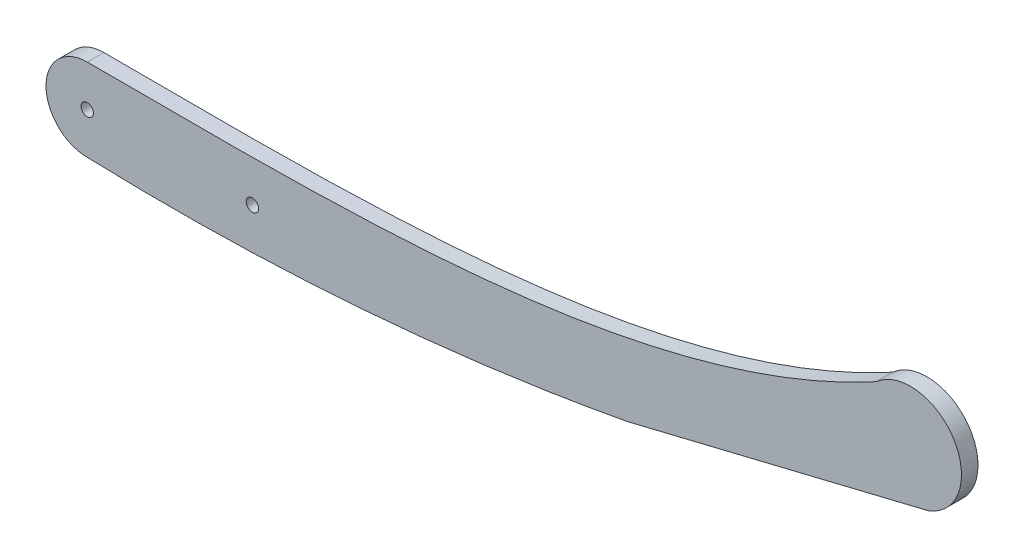
ISO-10303-21;
HEADER;
FILE_DESCRIPTION(('STEP AP214'),'2;1');
FILE_NAME('part.step','',(''),(''),'','','');
FILE_SCHEMA(('AUTOMOTIVE_DESIGN { 1 0 10303 214 1 1 1 1 }'));
ENDSEC;
DATA;
#1=APPLICATION_CONTEXT('core data for automotive mechanical design processes');
#2=APPLICATION_PROTOCOL_DEFINITION('international standard','automotive_design',2000,#1);
#3=PRODUCT_CONTEXT('',#1,'mechanical');
#4=PRODUCT('Part','Part','',(#3));
#5=PRODUCT_RELATED_PRODUCT_CATEGORY('part','',(#4));
#6=PRODUCT_DEFINITION_FORMATION('','',#4);
#7=PRODUCT_DEFINITION_CONTEXT('part definition',#1,'design');
#8=PRODUCT_DEFINITION('design','',#6,#7);
#9=PRODUCT_DEFINITION_SHAPE('','',#8);
#10=(LENGTH_UNIT() NAMED_UNIT(*) SI_UNIT(.MILLI.,.METRE.));
#11=(NAMED_UNIT(*) PLANE_ANGLE_UNIT() SI_UNIT($,.RADIAN.));
#12=(NAMED_UNIT(*) SI_UNIT($,.STERADIAN.) SOLID_ANGLE_UNIT());
#13=UNCERTAINTY_MEASURE_WITH_UNIT(LENGTH_MEASURE(1.E-05),#10,'distance_accuracy_value','');
#14=(GEOMETRIC_REPRESENTATION_CONTEXT(3) GLOBAL_UNCERTAINTY_ASSIGNED_CONTEXT((#13)) GLOBAL_UNIT_ASSIGNED_CONTEXT((#10,
#11,#12)) REPRESENTATION_CONTEXT('',''));
#15=CARTESIAN_POINT('',(0.,0.,0.));
#16=DIRECTION('',(0.,0.,1.));
#17=DIRECTION('',(1.,0.,0.));
#18=AXIS2_PLACEMENT_3D('',#15,#16,#17);
#19=CARTESIAN_POINT('',(-40.,-9.99999999997781,4.));
#20=CARTESIAN_POINT('',(4.02594483073209,-11.4538358401675,4.));
#21=CARTESIAN_POINT('',(47.6497028699741,-8.12050250477484,4.));
#22=CARTESIAN_POINT('',(90.8712741189043,1.71672525675507E-11,4.));
#23=B_SPLINE_CURVE_WITH_KNOTS('',3,(#19,#20,#21,#22),.UNSPECIFIED.,.F.,.F.,(4,4),(0.,
0.653509957849022),.UNSPECIFIED.);
#24=DIRECTION('',(0.,0.,-1.));
#25=VECTOR('',#24,1.);
#26=SURFACE_OF_LINEAR_EXTRUSION('',#23,#25);
#27=CARTESIAN_POINT('',(-40.,-9.99999999997781,0.));
#28=CARTESIAN_POINT('',(4.02594483073209,-11.4538358401675,0.));
#29=CARTESIAN_POINT('',(47.6497028699741,-8.12050250477484,0.));
#30=CARTESIAN_POINT('',(90.8712741189043,1.71672525675507E-11,0.));
#31=B_SPLINE_CURVE_WITH_KNOTS('',3,(#27,#28,#29,#30),.UNSPECIFIED.,.F.,.F.,(4,4),(0.,
0.653509957849022),.UNSPECIFIED.);
#32=CARTESIAN_POINT('',(-40.,-9.99999999997781,0.));
#33=VERTEX_POINT('',#32);
#34=CARTESIAN_POINT('',(90.8712741189043,1.71672525675507E-11,0.));
#35=VERTEX_POINT('',#34);
#36=EDGE_CURVE('E158',#33,#35,#31,.T.);
#37=ORIENTED_EDGE('',*,*,#36,.T.);
#38=DIRECTION('',(0.,0.,-1.));
#39=VECTOR('',#38,1.);
#40=CARTESIAN_POINT('',(90.8712741189043,1.71672525675507E-11,4.));
#41=LINE('',#40,#39);
#42=CARTESIAN_POINT('',(90.8712741189043,1.71672525675507E-11,4.));
#43=VERTEX_POINT('',#42);
#44=EDGE_CURVE('E11',#43,#35,#41,.T.);
#45=ORIENTED_EDGE('',*,*,#44,.F.);
#46=CARTESIAN_POINT('',(-40.,-9.99999999997781,4.));
#47=VERTEX_POINT('',#46);
#48=EDGE_CURVE('E131',#47,#43,#23,.T.);
#49=ORIENTED_EDGE('',*,*,#48,.F.);
#50=DIRECTION('',(0.,0.,-1.));
#51=VECTOR('',#50,1.);
#52=CARTESIAN_POINT('',(-40.,-9.99999999997781,4.));
#53=LINE('',#52,#51);
#54=EDGE_CURVE('E106',#47,#33,#53,.T.);
#55=ORIENTED_EDGE('',*,*,#54,.T.);
#56=EDGE_LOOP('',(#37,#45,#49,#55));
#57=FACE_BOUND('',#56,.T.);
#58=ADVANCED_FACE('F36',(#57),#26,.F.);
#59=CARTESIAN_POINT('',(5.08285377273645,-20.8818101708942,4.));
#60=DIRECTION('',(-0.23650509394564,0.971630248879564,0.));
#61=DIRECTION('',(-0.971630248879565,-0.23650509394564,0.));
#62=AXIS2_PLACEMENT_3D('',#59,#60,#61);
#63=PLANE('',#62);
#64=DIRECTION('',(0.971630248879565,0.23650509394564,0.));
#65=VECTOR('',#64,1.);
#66=CARTESIAN_POINT('',(5.08285377273645,-20.8818101708942,0.));
#67=LINE('',#66,#65);
#68=CARTESIAN_POINT('',(163.684000860577,17.7233889109076,0.));
#69=VERTEX_POINT('',#68);
#70=EDGE_CURVE('E157',#35,#69,#67,.T.);
#71=ORIENTED_EDGE('',*,*,#70,.T.);
#72=DIRECTION('',(0.,0.,-1.));
#73=VECTOR('',#72,1.);
#74=CARTESIAN_POINT('',(163.684000860577,17.7233889109076,4.));
#75=LINE('',#74,#73);
#76=CARTESIAN_POINT('',(163.684000860577,17.7233889109076,4.));
#77=VERTEX_POINT('',#76);
#78=EDGE_CURVE('E45',#77,#69,#75,.T.);
#79=ORIENTED_EDGE('',*,*,#78,.F.);
#80=DIRECTION('',(0.971630248879565,0.23650509394564,0.));
#81=VECTOR('',#80,1.);
#82=CARTESIAN_POINT('',(5.08285377273645,-20.8818101708942,4.));
#83=LINE('',#82,#81);
#84=EDGE_CURVE('E83',#43,#77,#83,.T.);
#85=ORIENTED_EDGE('',*,*,#84,.F.);
#86=ORIENTED_EDGE('',*,*,#44,.T.);
#87=EDGE_LOOP('',(#71,#79,#85,#86));
#88=FACE_BOUND('',#87,.T.);
#89=ADVANCED_FACE('F125',(#88),#63,.F.);
#90=CARTESIAN_POINT('',(159.388191828581,29.3174132501751,4.));
#91=DIRECTION('',(0.,0.,-1.));
#92=DIRECTION('',(-1.,0.,0.));
#93=AXIS2_PLACEMENT_3D('',#90,#91,#92);
#94=CYLINDRICAL_SURFACE('',#93,12.3642782085698);
#95=CARTESIAN_POINT('',(159.388191828581,29.3174132501751,0.));
#96=DIRECTION('',(0.,0.,1.));
#97=DIRECTION('',(1.,0.,0.));
#98=AXIS2_PLACEMENT_3D('',#95,#96,#97);
#99=CIRCLE('',#98,12.3642782085698);
#100=CARTESIAN_POINT('',(151.130268959291,38.5197002215628,0.));
#101=VERTEX_POINT('',#100);
#102=EDGE_CURVE('E99',#69,#101,#99,.T.);
#103=ORIENTED_EDGE('',*,*,#102,.T.);
#104=DIRECTION('',(0.,0.,-1.));
#105=VECTOR('',#104,1.);
#106=CARTESIAN_POINT('',(151.130268959291,38.5197002215628,4.));
#107=LINE('',#106,#105);
#108=CARTESIAN_POINT('',(151.130268959291,38.5197002215628,4.));
#109=VERTEX_POINT('',#108);
#110=EDGE_CURVE('E96',#109,#101,#107,.T.);
#111=ORIENTED_EDGE('',*,*,#110,.F.);
#112=CARTESIAN_POINT('',(159.388191828581,29.3174132501751,4.));
#113=DIRECTION('',(0.,0.,1.));
#114=DIRECTION('',(1.,0.,0.));
#115=AXIS2_PLACEMENT_3D('',#112,#113,#114);
#116=CIRCLE('',#115,12.3642782085698);
#117=EDGE_CURVE('E87',#77,#109,#116,.T.);
#118=ORIENTED_EDGE('',*,*,#117,.F.);
#119=ORIENTED_EDGE('',*,*,#78,.T.);
#120=EDGE_LOOP('',(#103,#111,#118,#119));
#121=FACE_BOUND('',#120,.T.);
#122=ADVANCED_FACE('F97',(#121),#94,.T.);
#123=CARTESIAN_POINT('',(-40.,10.0000000000121,4.));
#124=CARTESIAN_POINT('',(22.9073195257892,9.88162892937321,4.));
#125=CARTESIAN_POINT('',(95.2353292449004,7.97620746986162,4.));
#126=CARTESIAN_POINT('',(151.130268959291,38.5197002215627,4.));
#127=B_SPLINE_CURVE_WITH_KNOTS('',3,(#123,#124,#125,#126),.UNSPECIFIED.,.F.,.F.,(4,4),(0.,
0.832549304319737),.UNSPECIFIED.);
#128=DIRECTION('',(0.,0.,-1.));
#129=VECTOR('',#128,1.);
#130=SURFACE_OF_LINEAR_EXTRUSION('',#127,#129);
#131=CARTESIAN_POINT('',(-40.,10.0000000000121,0.));
#132=CARTESIAN_POINT('',(22.9073195257892,9.88162892937321,0.));
#133=CARTESIAN_POINT('',(95.2353292449004,7.97620746986162,0.));
#134=CARTESIAN_POINT('',(151.130268959291,38.5197002215627,0.));
#135=B_SPLINE_CURVE_WITH_KNOTS('',3,(#131,#132,#133,#134),.UNSPECIFIED.,.F.,.F.,(4,4),(0.,
0.832549304319737),.UNSPECIFIED.);
#136=CARTESIAN_POINT('',(-40.,10.0000000000121,0.));
#137=VERTEX_POINT('',#136);
#138=EDGE_CURVE('E146',#137,#101,#135,.T.);
#139=ORIENTED_EDGE('',*,*,#138,.F.);
#140=DIRECTION('',(0.,0.,-1.));
#141=VECTOR('',#140,1.);
#142=CARTESIAN_POINT('',(-40.,10.0000000000121,4.));
#143=LINE('',#142,#141);
#144=CARTESIAN_POINT('',(-40.,10.0000000000121,4.));
#145=VERTEX_POINT('',#144);
#146=EDGE_CURVE('E72',#145,#137,#143,.T.);
#147=ORIENTED_EDGE('',*,*,#146,.F.);
#148=EDGE_CURVE('E91',#145,#109,#127,.T.);
#149=ORIENTED_EDGE('',*,*,#148,.T.);
#150=ORIENTED_EDGE('',*,*,#110,.T.);
#151=EDGE_LOOP('',(#139,#147,#149,#150));
#152=FACE_BOUND('',#151,.T.);
#153=ADVANCED_FACE('F104',(#152),#130,.T.);
#154=CARTESIAN_POINT('',(-40.,1.71616193478386E-11,4.));
#155=DIRECTION('',(0.,0.,-1.));
#156=DIRECTION('',(-1.,0.,0.));
#157=AXIS2_PLACEMENT_3D('',#154,#155,#156);
#158=CYLINDRICAL_SURFACE('',#157,1.5);
#159=CARTESIAN_POINT('',(-40.,1.71616193478386E-11,4.));
#160=DIRECTION('',(0.,0.,1.));
#161=DIRECTION('',(1.,0.,0.));
#162=AXIS2_PLACEMENT_3D('',#159,#160,#161);
#163=CIRCLE('',#162,1.5);
#164=CARTESIAN_POINT('',(-38.5,1.71616193478386E-11,4.));
#165=VERTEX_POINT('',#164);
#166=EDGE_CURVE('E136',#165,#165,#163,.T.);
#167=ORIENTED_EDGE('',*,*,#166,.T.);
#168=EDGE_LOOP('',(#167));
#169=FACE_BOUND('',#168,.T.);
#170=CARTESIAN_POINT('',(-40.,1.71616193478386E-11,0.));
#171=DIRECTION('',(0.,0.,1.));
#172=DIRECTION('',(1.,0.,0.));
#173=AXIS2_PLACEMENT_3D('',#170,#171,#172);
#174=CIRCLE('',#173,1.5);
#175=CARTESIAN_POINT('',(-38.5,1.71616193478386E-11,0.));
#176=VERTEX_POINT('',#175);
#177=EDGE_CURVE('E165',#176,#176,#174,.T.);
#178=ORIENTED_EDGE('',*,*,#177,.F.);
#179=EDGE_LOOP('',(#178));
#180=FACE_BOUND('',#179,.T.);
#181=ADVANCED_FACE('F120',(#169,#180),#158,.F.);
#182=CARTESIAN_POINT('',(0.,1.71665179350351E-11,4.));
#183=DIRECTION('',(0.,0.,-1.));
#184=DIRECTION('',(-1.,0.,0.));
#185=AXIS2_PLACEMENT_3D('',#182,#183,#184);
#186=CYLINDRICAL_SURFACE('',#185,1.5);
#187=CARTESIAN_POINT('',(0.,1.71665179350351E-11,4.));
#188=DIRECTION('',(0.,0.,1.));
#189=DIRECTION('',(1.,0.,0.));
#190=AXIS2_PLACEMENT_3D('',#187,#188,#189);
#191=CIRCLE('',#190,1.5);
#192=CARTESIAN_POINT('',(1.50000000000001,1.71665179350351E-11,4.));
#193=VERTEX_POINT('',#192);
#194=EDGE_CURVE('E142',#193,#193,#191,.T.);
#195=ORIENTED_EDGE('',*,*,#194,.T.);
#196=EDGE_LOOP('',(#195));
#197=FACE_BOUND('',#196,.T.);
#198=CARTESIAN_POINT('',(0.,1.71665179350351E-11,0.));
#199=DIRECTION('',(0.,0.,1.));
#200=DIRECTION('',(1.,0.,0.));
#201=AXIS2_PLACEMENT_3D('',#198,#199,#200);
#202=CIRCLE('',#201,1.5);
#203=CARTESIAN_POINT('',(1.50000000000001,1.71665179350351E-11,0.));
#204=VERTEX_POINT('',#203);
#205=EDGE_CURVE('E170',#204,#204,#202,.T.);
#206=ORIENTED_EDGE('',*,*,#205,.F.);
#207=EDGE_LOOP('',(#206));
#208=FACE_BOUND('',#207,.T.);
#209=ADVANCED_FACE('F38',(#197,#208),#186,.F.);
#210=CARTESIAN_POINT('',(-40.,1.71616193478386E-11,4.));
#211=DIRECTION('',(0.,0.,-1.));
#212=DIRECTION('',(-1.,0.,0.));
#213=AXIS2_PLACEMENT_3D('',#210,#211,#212);
#214=CYLINDRICAL_SURFACE('',#213,9.99999999999497);
#215=CARTESIAN_POINT('',(-40.,1.71616193478386E-11,0.));
#216=DIRECTION('',(0.,0.,1.));
#217=DIRECTION('',(1.,0.,0.));
#218=AXIS2_PLACEMENT_3D('',#215,#216,#217);
#219=CIRCLE('',#218,9.99999999999497);
#220=EDGE_CURVE('E75',#137,#33,#219,.T.);
#221=ORIENTED_EDGE('',*,*,#220,.T.);
#222=ORIENTED_EDGE('',*,*,#54,.F.);
#223=CARTESIAN_POINT('',(-40.,1.71616193478386E-11,4.));
#224=DIRECTION('',(0.,0.,1.));
#225=DIRECTION('',(1.,0.,0.));
#226=AXIS2_PLACEMENT_3D('',#223,#224,#225);
#227=CIRCLE('',#226,9.99999999999497);
#228=EDGE_CURVE('E53',#145,#47,#227,.T.);
#229=ORIENTED_EDGE('',*,*,#228,.F.);
#230=ORIENTED_EDGE('',*,*,#146,.T.);
#231=EDGE_LOOP('',(#221,#222,#229,#230));
#232=FACE_BOUND('',#231,.T.);
#233=ADVANCED_FACE('F121',(#232),#214,.T.);
#234=CARTESIAN_POINT('',(0.,0.,4.));
#235=DIRECTION('',(0.,0.,1.));
#236=DIRECTION('',(1.,0.,0.));
#237=AXIS2_PLACEMENT_3D('',#234,#235,#236);
#238=PLANE('',#237);
#239=ORIENTED_EDGE('',*,*,#194,.F.);
#240=EDGE_LOOP('',(#239));
#241=FACE_BOUND('',#240,.T.);
#242=ORIENTED_EDGE('',*,*,#166,.F.);
#243=EDGE_LOOP('',(#242));
#244=FACE_BOUND('',#243,.T.);
#245=ORIENTED_EDGE('',*,*,#48,.T.);
#246=ORIENTED_EDGE('',*,*,#84,.T.);
#247=ORIENTED_EDGE('',*,*,#117,.T.);
#248=ORIENTED_EDGE('',*,*,#148,.F.);
#249=ORIENTED_EDGE('',*,*,#228,.T.);
#250=EDGE_LOOP('',(#245,#246,#247,#248,#249));
#251=FACE_BOUND('',#250,.T.);
#252=ADVANCED_FACE('F89',(#241,#244,#251),#238,.T.);
#253=CARTESIAN_POINT('',(0.,0.,0.));
#254=DIRECTION('',(0.,0.,1.));
#255=DIRECTION('',(1.,0.,0.));
#256=AXIS2_PLACEMENT_3D('',#253,#254,#255);
#257=PLANE('',#256);
#258=ORIENTED_EDGE('',*,*,#205,.T.);
#259=EDGE_LOOP('',(#258));
#260=FACE_BOUND('',#259,.T.);
#261=ORIENTED_EDGE('',*,*,#177,.T.);
#262=EDGE_LOOP('',(#261));
#263=FACE_BOUND('',#262,.T.);
#264=ORIENTED_EDGE('',*,*,#36,.F.);
#265=ORIENTED_EDGE('',*,*,#220,.F.);
#266=ORIENTED_EDGE('',*,*,#138,.T.);
#267=ORIENTED_EDGE('',*,*,#102,.F.);
#268=ORIENTED_EDGE('',*,*,#70,.F.);
#269=EDGE_LOOP('',(#264,#265,#266,#267,#268));
#270=FACE_BOUND('',#269,.T.);
#271=ADVANCED_FACE('F156',(#260,#263,#270),#257,.F.);
#272=CLOSED_SHELL('',(#58,#89,#122,#153,#181,#209,#233,#252,#271));
#273=MANIFOLD_SOLID_BREP('B2',#272);
#274=ADVANCED_BREP_SHAPE_REPRESENTATION('',(#18,#273),#14);
#275=SHAPE_DEFINITION_REPRESENTATION(#9,#274);
ENDSEC;
END-ISO-10303-21;
